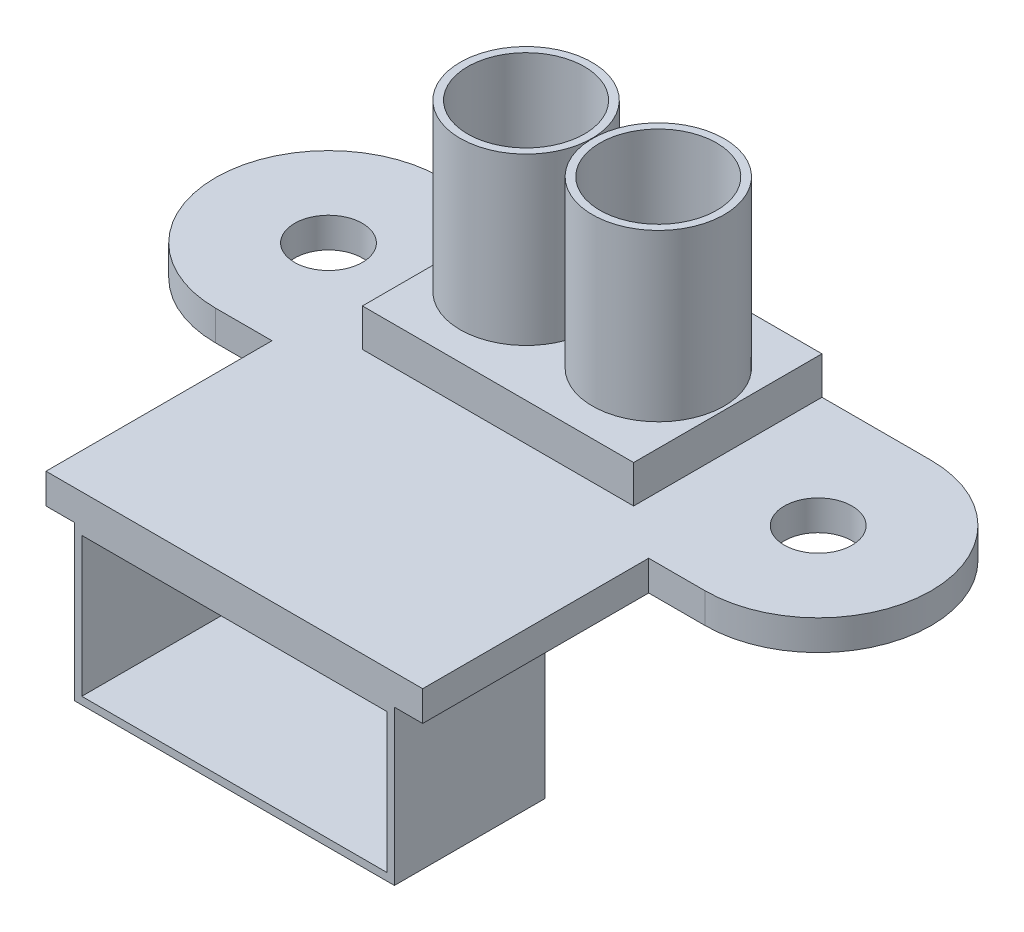
ISO-10303-21;
HEADER;
FILE_DESCRIPTION(('STEP AP214'),'2;1');
FILE_NAME('part.step','',(''),(''),'','','');
FILE_SCHEMA(('AUTOMOTIVE_DESIGN { 1 0 10303 214 1 1 1 1 }'));
ENDSEC;
DATA;
#1=APPLICATION_CONTEXT('core data for automotive mechanical design processes');
#2=APPLICATION_PROTOCOL_DEFINITION('international standard','automotive_design',2000,#1);
#3=PRODUCT_CONTEXT('',#1,'mechanical');
#4=PRODUCT('Part','Part','',(#3));
#5=PRODUCT_RELATED_PRODUCT_CATEGORY('part','',(#4));
#6=PRODUCT_DEFINITION_FORMATION('','',#4);
#7=PRODUCT_DEFINITION_CONTEXT('part definition',#1,'design');
#8=PRODUCT_DEFINITION('design','',#6,#7);
#9=PRODUCT_DEFINITION_SHAPE('','',#8);
#10=(LENGTH_UNIT() NAMED_UNIT(*) SI_UNIT(.MILLI.,.METRE.));
#11=(NAMED_UNIT(*) PLANE_ANGLE_UNIT() SI_UNIT($,.RADIAN.));
#12=(NAMED_UNIT(*) SI_UNIT($,.STERADIAN.) SOLID_ANGLE_UNIT());
#13=UNCERTAINTY_MEASURE_WITH_UNIT(LENGTH_MEASURE(1.E-05),#10,'distance_accuracy_value','');
#14=(GEOMETRIC_REPRESENTATION_CONTEXT(3) GLOBAL_UNCERTAINTY_ASSIGNED_CONTEXT((#13)) GLOBAL_UNIT_ASSIGNED_CONTEXT((#10,
#11,#12)) REPRESENTATION_CONTEXT('',''));
#15=CARTESIAN_POINT('',(0.,0.,0.));
#16=DIRECTION('',(0.,0.,1.));
#17=DIRECTION('',(1.,0.,0.));
#18=AXIS2_PLACEMENT_3D('',#15,#16,#17);
#19=CARTESIAN_POINT('',(-5.,0.8,9.));
#20=DIRECTION('',(0.,0.,-1.));
#21=DIRECTION('',(-1.,0.,0.));
#22=AXIS2_PLACEMENT_3D('',#19,#20,#21);
#23=PLANE('',#22);
#24=DIRECTION('',(1.,0.,0.));
#25=VECTOR('',#24,1.);
#26=CARTESIAN_POINT('',(-5.,0.,9.));
#27=LINE('',#26,#25);
#28=CARTESIAN_POINT('',(-5.,0.,9.));
#29=VERTEX_POINT('',#28);
#30=CARTESIAN_POINT('',(-4.25,0.,9.));
#31=VERTEX_POINT('',#30);
#32=EDGE_CURVE('E328',#29,#31,#27,.T.);
#33=ORIENTED_EDGE('',*,*,#32,.T.);
#34=DIRECTION('',(0.,1.,0.));
#35=VECTOR('',#34,1.);
#36=CARTESIAN_POINT('',(-4.25,-4.1,9.));
#37=LINE('',#36,#35);
#38=CARTESIAN_POINT('',(-4.25,-4.1,9.));
#39=VERTEX_POINT('',#38);
#40=EDGE_CURVE('E224',#39,#31,#37,.T.);
#41=ORIENTED_EDGE('',*,*,#40,.F.);
#42=DIRECTION('',(-1.,0.,0.));
#43=VECTOR('',#42,1.);
#44=CARTESIAN_POINT('',(-4.25,-4.1,9.));
#45=LINE('',#44,#43);
#46=CARTESIAN_POINT('',(4.25,-4.1,9.));
#47=VERTEX_POINT('',#46);
#48=EDGE_CURVE('E222',#47,#39,#45,.T.);
#49=ORIENTED_EDGE('',*,*,#48,.F.);
#50=DIRECTION('',(0.,1.,0.));
#51=VECTOR('',#50,1.);
#52=CARTESIAN_POINT('',(4.25,-4.1,9.));
#53=LINE('',#52,#51);
#54=CARTESIAN_POINT('',(4.25,0.,9.));
#55=VERTEX_POINT('',#54);
#56=EDGE_CURVE('E232',#47,#55,#53,.T.);
#57=ORIENTED_EDGE('',*,*,#56,.T.);
#58=CARTESIAN_POINT('',(5.,0.,9.));
#59=VERTEX_POINT('',#58);
#60=EDGE_CURVE('E327',#55,#59,#27,.T.);
#61=ORIENTED_EDGE('',*,*,#60,.T.);
#62=DIRECTION('',(0.,-1.,0.));
#63=VECTOR('',#62,1.);
#64=CARTESIAN_POINT('',(5.,0.8,9.));
#65=LINE('',#64,#63);
#66=CARTESIAN_POINT('',(5.,0.8,9.));
#67=VERTEX_POINT('',#66);
#68=EDGE_CURVE('E349',#67,#59,#65,.T.);
#69=ORIENTED_EDGE('',*,*,#68,.F.);
#70=DIRECTION('',(1.,0.,0.));
#71=VECTOR('',#70,1.);
#72=CARTESIAN_POINT('',(-5.,0.8,9.));
#73=LINE('',#72,#71);
#74=CARTESIAN_POINT('',(-5.,0.8,9.));
#75=VERTEX_POINT('',#74);
#76=EDGE_CURVE('E309',#75,#67,#73,.T.);
#77=ORIENTED_EDGE('',*,*,#76,.F.);
#78=DIRECTION('',(0.,-1.,0.));
#79=VECTOR('',#78,1.);
#80=CARTESIAN_POINT('',(-5.,0.8,9.));
#81=LINE('',#80,#79);
#82=EDGE_CURVE('E352',#75,#29,#81,.T.);
#83=ORIENTED_EDGE('',*,*,#82,.T.);
#84=EDGE_LOOP('',(#33,#41,#49,#57,#61,#69,#77,#83));
#85=FACE_BOUND('',#84,.T.);
#86=DIRECTION('',(1.,0.,0.));
#87=VECTOR('',#86,1.);
#88=CARTESIAN_POINT('',(0.,-0.2,9.));
#89=LINE('',#88,#87);
#90=CARTESIAN_POINT('',(-4.05,-0.2,9.));
#91=VERTEX_POINT('',#90);
#92=CARTESIAN_POINT('',(4.05,-0.2,9.));
#93=VERTEX_POINT('',#92);
#94=EDGE_CURVE('E53',#91,#93,#89,.T.);
#95=ORIENTED_EDGE('',*,*,#94,.T.);
#96=DIRECTION('',(0.,-1.,0.));
#97=VECTOR('',#96,1.);
#98=CARTESIAN_POINT('',(4.05,0.,9.));
#99=LINE('',#98,#97);
#100=CARTESIAN_POINT('',(4.05,-3.9,9.));
#101=VERTEX_POINT('',#100);
#102=EDGE_CURVE('E191',#93,#101,#99,.T.);
#103=ORIENTED_EDGE('',*,*,#102,.T.);
#104=DIRECTION('',(1.,0.,0.));
#105=VECTOR('',#104,1.);
#106=CARTESIAN_POINT('',(0.,-3.9,9.));
#107=LINE('',#106,#105);
#108=CARTESIAN_POINT('',(-4.05,-3.9,9.));
#109=VERTEX_POINT('',#108);
#110=EDGE_CURVE('E203',#109,#101,#107,.T.);
#111=ORIENTED_EDGE('',*,*,#110,.F.);
#112=DIRECTION('',(0.,-1.,0.));
#113=VECTOR('',#112,1.);
#114=CARTESIAN_POINT('',(-4.05,0.,9.));
#115=LINE('',#114,#113);
#116=EDGE_CURVE('E201',#91,#109,#115,.T.);
#117=ORIENTED_EDGE('',*,*,#116,.F.);
#118=EDGE_LOOP('',(#95,#103,#111,#117));
#119=FACE_BOUND('',#118,.T.);
#120=ADVANCED_FACE('F38',(#85,#119),#23,.F.);
#121=CARTESIAN_POINT('',(-6.5,0.,0.));
#122=DIRECTION('',(0.,1.,0.));
#123=DIRECTION('',(0.,0.,1.));
#124=AXIS2_PLACEMENT_3D('',#121,#122,#123);
#125=PLANE('',#124);
#126=CARTESIAN_POINT('',(6.5,0.,0.));
#127=DIRECTION('',(0.,1.,0.));
#128=DIRECTION('',(0.,0.,1.));
#129=AXIS2_PLACEMENT_3D('',#126,#127,#128);
#130=CIRCLE('',#129,0.9);
#131=CARTESIAN_POINT('',(6.5,0.,0.9));
#132=VERTEX_POINT('',#131);
#133=EDGE_CURVE('E288',#132,#132,#130,.T.);
#134=ORIENTED_EDGE('',*,*,#133,.T.);
#135=EDGE_LOOP('',(#134));
#136=FACE_BOUND('',#135,.T.);
#137=CARTESIAN_POINT('',(-6.5,0.,0.));
#138=DIRECTION('',(0.,1.,0.));
#139=DIRECTION('',(0.,0.,1.));
#140=AXIS2_PLACEMENT_3D('',#137,#138,#139);
#141=CIRCLE('',#140,0.899999999999999);
#142=CARTESIAN_POINT('',(-6.5,0.,0.899999999999999));
#143=VERTEX_POINT('',#142);
#144=EDGE_CURVE('E292',#143,#143,#141,.T.);
#145=ORIENTED_EDGE('',*,*,#144,.T.);
#146=EDGE_LOOP('',(#145));
#147=FACE_BOUND('',#146,.T.);
#148=DIRECTION('',(0.,0.,-1.));
#149=VECTOR('',#148,1.);
#150=CARTESIAN_POINT('',(-4.25,0.,9.));
#151=LINE('',#150,#149);
#152=CARTESIAN_POINT('',(-4.25,0.,5.));
#153=VERTEX_POINT('',#152);
#154=EDGE_CURVE('E210',#31,#153,#151,.T.);
#155=ORIENTED_EDGE('',*,*,#154,.F.);
#156=ORIENTED_EDGE('',*,*,#32,.F.);
#157=DIRECTION('',(0.,0.,1.));
#158=VECTOR('',#157,1.);
#159=CARTESIAN_POINT('',(-5.,0.,3.));
#160=LINE('',#159,#158);
#161=CARTESIAN_POINT('',(-5.,0.,3.));
#162=VERTEX_POINT('',#161);
#163=EDGE_CURVE('E325',#162,#29,#160,.T.);
#164=ORIENTED_EDGE('',*,*,#163,.F.);
#165=DIRECTION('',(1.,0.,0.));
#166=VECTOR('',#165,1.);
#167=CARTESIAN_POINT('',(-6.5,0.,3.));
#168=LINE('',#167,#166);
#169=CARTESIAN_POINT('',(-6.5,0.,3.));
#170=VERTEX_POINT('',#169);
#171=EDGE_CURVE('E323',#170,#162,#168,.T.);
#172=ORIENTED_EDGE('',*,*,#171,.F.);
#173=CARTESIAN_POINT('',(-6.5,0.,0.));
#174=DIRECTION('',(0.,1.,0.));
#175=DIRECTION('',(0.,0.,1.));
#176=AXIS2_PLACEMENT_3D('',#173,#174,#175);
#177=CIRCLE('',#176,3.);
#178=CARTESIAN_POINT('',(-6.5,0.,-3.));
#179=VERTEX_POINT('',#178);
#180=EDGE_CURVE('E298',#179,#170,#177,.T.);
#181=ORIENTED_EDGE('',*,*,#180,.F.);
#182=DIRECTION('',(-1.,0.,0.));
#183=VECTOR('',#182,1.);
#184=CARTESIAN_POINT('',(-6.5,0.,-3.));
#185=LINE('',#184,#183);
#186=CARTESIAN_POINT('',(6.5,0.,-3.));
#187=VERTEX_POINT('',#186);
#188=EDGE_CURVE('E305',#187,#179,#185,.T.);
#189=ORIENTED_EDGE('',*,*,#188,.F.);
#190=CARTESIAN_POINT('',(6.5,0.,0.));
#191=DIRECTION('',(0.,1.,0.));
#192=DIRECTION('',(0.,0.,1.));
#193=AXIS2_PLACEMENT_3D('',#190,#191,#192);
#194=CIRCLE('',#193,3.);
#195=CARTESIAN_POINT('',(6.5,0.,3.));
#196=VERTEX_POINT('',#195);
#197=EDGE_CURVE('E335',#196,#187,#194,.T.);
#198=ORIENTED_EDGE('',*,*,#197,.F.);
#199=DIRECTION('',(1.,0.,0.));
#200=VECTOR('',#199,1.);
#201=CARTESIAN_POINT('',(5.,0.,3.));
#202=LINE('',#201,#200);
#203=CARTESIAN_POINT('',(5.,0.,3.));
#204=VERTEX_POINT('',#203);
#205=EDGE_CURVE('E333',#204,#196,#202,.T.);
#206=ORIENTED_EDGE('',*,*,#205,.F.);
#207=DIRECTION('',(0.,0.,-1.));
#208=VECTOR('',#207,1.);
#209=CARTESIAN_POINT('',(5.,0.,9.));
#210=LINE('',#209,#208);
#211=EDGE_CURVE('E331',#59,#204,#210,.T.);
#212=ORIENTED_EDGE('',*,*,#211,.F.);
#213=ORIENTED_EDGE('',*,*,#60,.F.);
#214=DIRECTION('',(0.,0.,1.));
#215=VECTOR('',#214,1.);
#216=CARTESIAN_POINT('',(4.25,0.,9.));
#217=LINE('',#216,#215);
#218=CARTESIAN_POINT('',(4.25,0.,5.));
#219=VERTEX_POINT('',#218);
#220=EDGE_CURVE('E218',#219,#55,#217,.T.);
#221=ORIENTED_EDGE('',*,*,#220,.F.);
#222=DIRECTION('',(1.,0.,0.));
#223=VECTOR('',#222,1.);
#224=CARTESIAN_POINT('',(-4.25,0.,5.));
#225=LINE('',#224,#223);
#226=EDGE_CURVE('E61',#153,#219,#225,.T.);
#227=ORIENTED_EDGE('',*,*,#226,.F.);
#228=EDGE_LOOP('',(#155,#156,#164,#172,#181,#189,#198,#206,#212,#213,#221,#227));
#229=FACE_BOUND('',#228,.T.);
#230=ADVANCED_FACE('F392',(#136,#147,#229),#125,.F.);
#231=CARTESIAN_POINT('',(-6.5,0.8,0.));
#232=DIRECTION('',(0.,1.,0.));
#233=DIRECTION('',(0.,0.,1.));
#234=AXIS2_PLACEMENT_3D('',#231,#232,#233);
#235=PLANE('',#234);
#236=DIRECTION('',(0.,0.,1.));
#237=VECTOR('',#236,1.);
#238=CARTESIAN_POINT('',(-3.6,0.8,-3.));
#239=LINE('',#238,#237);
#240=CARTESIAN_POINT('',(-3.6,0.8,-3.));
#241=VERTEX_POINT('',#240);
#242=CARTESIAN_POINT('',(-3.6,0.8,2.));
#243=VERTEX_POINT('',#242);
#244=EDGE_CURVE('E256',#241,#243,#239,.T.);
#245=ORIENTED_EDGE('',*,*,#244,.F.);
#246=DIRECTION('',(-1.,0.,0.));
#247=VECTOR('',#246,1.);
#248=CARTESIAN_POINT('',(-6.5,0.8,-3.));
#249=LINE('',#248,#247);
#250=CARTESIAN_POINT('',(-6.5,0.8,-3.));
#251=VERTEX_POINT('',#250);
#252=EDGE_CURVE('E317',#241,#251,#249,.T.);
#253=ORIENTED_EDGE('',*,*,#252,.T.);
#254=CARTESIAN_POINT('',(-6.5,0.8,0.));
#255=DIRECTION('',(0.,1.,0.));
#256=DIRECTION('',(0.,0.,1.));
#257=AXIS2_PLACEMENT_3D('',#254,#255,#256);
#258=CIRCLE('',#257,3.);
#259=CARTESIAN_POINT('',(-6.5,0.8,3.));
#260=VERTEX_POINT('',#259);
#261=EDGE_CURVE('E301',#251,#260,#258,.T.);
#262=ORIENTED_EDGE('',*,*,#261,.T.);
#263=DIRECTION('',(1.,0.,0.));
#264=VECTOR('',#263,1.);
#265=CARTESIAN_POINT('',(-6.5,0.8,3.));
#266=LINE('',#265,#264);
#267=CARTESIAN_POINT('',(-5.,0.8,3.));
#268=VERTEX_POINT('',#267);
#269=EDGE_CURVE('E304',#260,#268,#266,.T.);
#270=ORIENTED_EDGE('',*,*,#269,.T.);
#271=DIRECTION('',(0.,0.,1.));
#272=VECTOR('',#271,1.);
#273=CARTESIAN_POINT('',(-5.,0.8,3.));
#274=LINE('',#273,#272);
#275=EDGE_CURVE('E307',#268,#75,#274,.T.);
#276=ORIENTED_EDGE('',*,*,#275,.T.);
#277=ORIENTED_EDGE('',*,*,#76,.T.);
#278=DIRECTION('',(0.,0.,-1.));
#279=VECTOR('',#278,1.);
#280=CARTESIAN_POINT('',(5.,0.8,9.));
#281=LINE('',#280,#279);
#282=CARTESIAN_POINT('',(5.,0.8,3.));
#283=VERTEX_POINT('',#282);
#284=EDGE_CURVE('E311',#67,#283,#281,.T.);
#285=ORIENTED_EDGE('',*,*,#284,.T.);
#286=DIRECTION('',(1.,0.,0.));
#287=VECTOR('',#286,1.);
#288=CARTESIAN_POINT('',(5.,0.8,3.));
#289=LINE('',#288,#287);
#290=CARTESIAN_POINT('',(6.5,0.8,3.));
#291=VERTEX_POINT('',#290);
#292=EDGE_CURVE('E313',#283,#291,#289,.T.);
#293=ORIENTED_EDGE('',*,*,#292,.T.);
#294=CARTESIAN_POINT('',(6.5,0.8,0.));
#295=DIRECTION('',(0.,1.,0.));
#296=DIRECTION('',(0.,0.,1.));
#297=AXIS2_PLACEMENT_3D('',#294,#295,#296);
#298=CIRCLE('',#297,3.);
#299=CARTESIAN_POINT('',(6.5,0.8,-3.));
#300=VERTEX_POINT('',#299);
#301=EDGE_CURVE('E315',#291,#300,#298,.T.);
#302=ORIENTED_EDGE('',*,*,#301,.T.);
#303=CARTESIAN_POINT('',(3.6,0.8,-3.));
#304=VERTEX_POINT('',#303);
#305=EDGE_CURVE('E318',#300,#304,#249,.T.);
#306=ORIENTED_EDGE('',*,*,#305,.T.);
#307=DIRECTION('',(0.,0.,-1.));
#308=VECTOR('',#307,1.);
#309=CARTESIAN_POINT('',(3.6,0.8,-3.));
#310=LINE('',#309,#308);
#311=CARTESIAN_POINT('',(3.6,0.8,2.));
#312=VERTEX_POINT('',#311);
#313=EDGE_CURVE('E263',#312,#304,#310,.T.);
#314=ORIENTED_EDGE('',*,*,#313,.F.);
#315=DIRECTION('',(1.,0.,0.));
#316=VECTOR('',#315,1.);
#317=CARTESIAN_POINT('',(-3.6,0.8,2.));
#318=LINE('',#317,#316);
#319=EDGE_CURVE('E272',#243,#312,#318,.T.);
#320=ORIENTED_EDGE('',*,*,#319,.F.);
#321=EDGE_LOOP('',(#245,#253,#262,#270,#276,#277,#285,#293,#302,#306,#314,#320));
#322=FACE_BOUND('',#321,.T.);
#323=CARTESIAN_POINT('',(-6.5,0.8,0.));
#324=DIRECTION('',(0.,1.,0.));
#325=DIRECTION('',(0.,0.,1.));
#326=AXIS2_PLACEMENT_3D('',#323,#324,#325);
#327=CIRCLE('',#326,0.899999999999999);
#328=CARTESIAN_POINT('',(-6.5,0.8,0.899999999999999));
#329=VERTEX_POINT('',#328);
#330=EDGE_CURVE('E295',#329,#329,#327,.T.);
#331=ORIENTED_EDGE('',*,*,#330,.F.);
#332=EDGE_LOOP('',(#331));
#333=FACE_BOUND('',#332,.T.);
#334=CARTESIAN_POINT('',(6.5,0.8,0.));
#335=DIRECTION('',(0.,1.,0.));
#336=DIRECTION('',(0.,0.,1.));
#337=AXIS2_PLACEMENT_3D('',#334,#335,#336);
#338=CIRCLE('',#337,0.9);
#339=CARTESIAN_POINT('',(6.5,0.8,0.9));
#340=VERTEX_POINT('',#339);
#341=EDGE_CURVE('E289',#340,#340,#338,.T.);
#342=ORIENTED_EDGE('',*,*,#341,.F.);
#343=EDGE_LOOP('',(#342));
#344=FACE_BOUND('',#343,.T.);
#345=ADVANCED_FACE('F398',(#322,#333,#344),#235,.T.);
#346=CARTESIAN_POINT('',(-6.5,0.8,0.));
#347=DIRECTION('',(0.,-1.,0.));
#348=DIRECTION('',(0.,0.,-1.));
#349=AXIS2_PLACEMENT_3D('',#346,#347,#348);
#350=CYLINDRICAL_SURFACE('',#349,3.);
#351=ORIENTED_EDGE('',*,*,#180,.T.);
#352=DIRECTION('',(0.,-1.,0.));
#353=VECTOR('',#352,1.);
#354=CARTESIAN_POINT('',(-6.5,0.8,3.));
#355=LINE('',#354,#353);
#356=EDGE_CURVE('E358',#260,#170,#355,.T.);
#357=ORIENTED_EDGE('',*,*,#356,.F.);
#358=ORIENTED_EDGE('',*,*,#261,.F.);
#359=DIRECTION('',(0.,-1.,0.));
#360=VECTOR('',#359,1.);
#361=CARTESIAN_POINT('',(-6.5,0.8,-3.));
#362=LINE('',#361,#360);
#363=EDGE_CURVE('E320',#251,#179,#362,.T.);
#364=ORIENTED_EDGE('',*,*,#363,.T.);
#365=EDGE_LOOP('',(#351,#357,#358,#364));
#366=FACE_BOUND('',#365,.T.);
#367=ADVANCED_FACE('F40',(#366),#350,.T.);
#368=CARTESIAN_POINT('',(-6.5,0.8,3.));
#369=DIRECTION('',(0.,0.,-1.));
#370=DIRECTION('',(-1.,0.,0.));
#371=AXIS2_PLACEMENT_3D('',#368,#369,#370);
#372=PLANE('',#371);
#373=ORIENTED_EDGE('',*,*,#171,.T.);
#374=DIRECTION('',(0.,-1.,0.));
#375=VECTOR('',#374,1.);
#376=CARTESIAN_POINT('',(-5.,0.8,3.));
#377=LINE('',#376,#375);
#378=EDGE_CURVE('E355',#268,#162,#377,.T.);
#379=ORIENTED_EDGE('',*,*,#378,.F.);
#380=ORIENTED_EDGE('',*,*,#269,.F.);
#381=ORIENTED_EDGE('',*,*,#356,.T.);
#382=EDGE_LOOP('',(#373,#379,#380,#381));
#383=FACE_BOUND('',#382,.T.);
#384=ADVANCED_FACE('F408',(#383),#372,.F.);
#385=CARTESIAN_POINT('',(-5.,0.8,3.));
#386=DIRECTION('',(1.,0.,0.));
#387=DIRECTION('',(0.,0.,-1.));
#388=AXIS2_PLACEMENT_3D('',#385,#386,#387);
#389=PLANE('',#388);
#390=ORIENTED_EDGE('',*,*,#163,.T.);
#391=ORIENTED_EDGE('',*,*,#82,.F.);
#392=ORIENTED_EDGE('',*,*,#275,.F.);
#393=ORIENTED_EDGE('',*,*,#378,.T.);
#394=EDGE_LOOP('',(#390,#391,#392,#393));
#395=FACE_BOUND('',#394,.T.);
#396=ADVANCED_FACE('F406',(#395),#389,.F.);
#397=CARTESIAN_POINT('',(5.,0.8,9.));
#398=DIRECTION('',(-1.,0.,0.));
#399=DIRECTION('',(0.,0.,1.));
#400=AXIS2_PLACEMENT_3D('',#397,#398,#399);
#401=PLANE('',#400);
#402=ORIENTED_EDGE('',*,*,#211,.T.);
#403=DIRECTION('',(0.,-1.,0.));
#404=VECTOR('',#403,1.);
#405=CARTESIAN_POINT('',(5.,0.8,3.));
#406=LINE('',#405,#404);
#407=EDGE_CURVE('E346',#283,#204,#406,.T.);
#408=ORIENTED_EDGE('',*,*,#407,.F.);
#409=ORIENTED_EDGE('',*,*,#284,.F.);
#410=ORIENTED_EDGE('',*,*,#68,.T.);
#411=EDGE_LOOP('',(#402,#408,#409,#410));
#412=FACE_BOUND('',#411,.T.);
#413=ADVANCED_FACE('F404',(#412),#401,.F.);
#414=CARTESIAN_POINT('',(5.,0.8,3.));
#415=DIRECTION('',(0.,0.,-1.));
#416=DIRECTION('',(-1.,0.,0.));
#417=AXIS2_PLACEMENT_3D('',#414,#415,#416);
#418=PLANE('',#417);
#419=ORIENTED_EDGE('',*,*,#205,.T.);
#420=DIRECTION('',(0.,-1.,0.));
#421=VECTOR('',#420,1.);
#422=CARTESIAN_POINT('',(6.5,0.8,3.));
#423=LINE('',#422,#421);
#424=EDGE_CURVE('E343',#291,#196,#423,.T.);
#425=ORIENTED_EDGE('',*,*,#424,.F.);
#426=ORIENTED_EDGE('',*,*,#292,.F.);
#427=ORIENTED_EDGE('',*,*,#407,.T.);
#428=EDGE_LOOP('',(#419,#425,#426,#427));
#429=FACE_BOUND('',#428,.T.);
#430=ADVANCED_FACE('F497',(#429),#418,.F.);
#431=CARTESIAN_POINT('',(6.5,0.8,0.));
#432=DIRECTION('',(0.,-1.,0.));
#433=DIRECTION('',(0.,0.,-1.));
#434=AXIS2_PLACEMENT_3D('',#431,#432,#433);
#435=CYLINDRICAL_SURFACE('',#434,3.);
#436=ORIENTED_EDGE('',*,*,#197,.T.);
#437=DIRECTION('',(0.,-1.,0.));
#438=VECTOR('',#437,1.);
#439=CARTESIAN_POINT('',(6.5,0.8,-3.));
#440=LINE('',#439,#438);
#441=EDGE_CURVE('E340',#300,#187,#440,.T.);
#442=ORIENTED_EDGE('',*,*,#441,.F.);
#443=ORIENTED_EDGE('',*,*,#301,.F.);
#444=ORIENTED_EDGE('',*,*,#424,.T.);
#445=EDGE_LOOP('',(#436,#442,#443,#444));
#446=FACE_BOUND('',#445,.T.);
#447=ADVANCED_FACE('F493',(#446),#435,.T.);
#448=CARTESIAN_POINT('',(-6.5,0.8,-3.));
#449=DIRECTION('',(0.,0.,1.));
#450=DIRECTION('',(1.,0.,0.));
#451=AXIS2_PLACEMENT_3D('',#448,#449,#450);
#452=PLANE('',#451);
#453=ORIENTED_EDGE('',*,*,#188,.T.);
#454=ORIENTED_EDGE('',*,*,#363,.F.);
#455=ORIENTED_EDGE('',*,*,#252,.F.);
#456=DIRECTION('',(0.,-1.,0.));
#457=VECTOR('',#456,1.);
#458=CARTESIAN_POINT('',(-3.6,1.8,-3.));
#459=LINE('',#458,#457);
#460=CARTESIAN_POINT('',(-3.6,1.8,-3.));
#461=VERTEX_POINT('',#460);
#462=EDGE_CURVE('E269',#461,#241,#459,.T.);
#463=ORIENTED_EDGE('',*,*,#462,.F.);
#464=DIRECTION('',(-1.,0.,0.));
#465=VECTOR('',#464,1.);
#466=CARTESIAN_POINT('',(-3.6,1.8,-3.));
#467=LINE('',#466,#465);
#468=CARTESIAN_POINT('',(3.6,1.8,-3.));
#469=VERTEX_POINT('',#468);
#470=EDGE_CURVE('E267',#469,#461,#467,.T.);
#471=ORIENTED_EDGE('',*,*,#470,.F.);
#472=DIRECTION('',(0.,-1.,0.));
#473=VECTOR('',#472,1.);
#474=CARTESIAN_POINT('',(3.6,1.8,-3.));
#475=LINE('',#474,#473);
#476=EDGE_CURVE('E279',#469,#304,#475,.T.);
#477=ORIENTED_EDGE('',*,*,#476,.T.);
#478=ORIENTED_EDGE('',*,*,#305,.F.);
#479=ORIENTED_EDGE('',*,*,#441,.T.);
#480=EDGE_LOOP('',(#453,#454,#455,#463,#471,#477,#478,#479));
#481=FACE_BOUND('',#480,.T.);
#482=ADVANCED_FACE('F481',(#481),#452,.F.);
#483=CARTESIAN_POINT('',(-6.5,0.8,0.));
#484=DIRECTION('',(0.,-1.,0.));
#485=DIRECTION('',(0.,0.,-1.));
#486=AXIS2_PLACEMENT_3D('',#483,#484,#485);
#487=CYLINDRICAL_SURFACE('',#486,0.899999999999999);
#488=ORIENTED_EDGE('',*,*,#330,.T.);
#489=EDGE_LOOP('',(#488));
#490=FACE_BOUND('',#489,.T.);
#491=ORIENTED_EDGE('',*,*,#144,.F.);
#492=EDGE_LOOP('',(#491));
#493=FACE_BOUND('',#492,.T.);
#494=ADVANCED_FACE('F511',(#490,#493),#487,.F.);
#495=CARTESIAN_POINT('',(6.5,0.8,0.));
#496=DIRECTION('',(0.,-1.,0.));
#497=DIRECTION('',(0.,0.,-1.));
#498=AXIS2_PLACEMENT_3D('',#495,#496,#497);
#499=CYLINDRICAL_SURFACE('',#498,0.9);
#500=ORIENTED_EDGE('',*,*,#341,.T.);
#501=EDGE_LOOP('',(#500));
#502=FACE_BOUND('',#501,.T.);
#503=ORIENTED_EDGE('',*,*,#133,.F.);
#504=EDGE_LOOP('',(#503));
#505=FACE_BOUND('',#504,.T.);
#506=ADVANCED_FACE('F517',(#502,#505),#499,.F.);
#507=CARTESIAN_POINT('',(-3.6,1.8,-3.));
#508=DIRECTION('',(1.,0.,0.));
#509=DIRECTION('',(0.,0.,-1.));
#510=AXIS2_PLACEMENT_3D('',#507,#508,#509);
#511=PLANE('',#510);
#512=ORIENTED_EDGE('',*,*,#244,.T.);
#513=DIRECTION('',(0.,-1.,0.));
#514=VECTOR('',#513,1.);
#515=CARTESIAN_POINT('',(-3.6,1.8,2.));
#516=LINE('',#515,#514);
#517=CARTESIAN_POINT('',(-3.6,1.8,2.));
#518=VERTEX_POINT('',#517);
#519=EDGE_CURVE('E285',#518,#243,#516,.T.);
#520=ORIENTED_EDGE('',*,*,#519,.F.);
#521=DIRECTION('',(0.,0.,1.));
#522=VECTOR('',#521,1.);
#523=CARTESIAN_POINT('',(-3.6,1.8,-3.));
#524=LINE('',#523,#522);
#525=EDGE_CURVE('E259',#461,#518,#524,.T.);
#526=ORIENTED_EDGE('',*,*,#525,.F.);
#527=ORIENTED_EDGE('',*,*,#462,.T.);
#528=EDGE_LOOP('',(#512,#520,#526,#527));
#529=FACE_BOUND('',#528,.T.);
#530=ADVANCED_FACE('F473',(#529),#511,.F.);
#531=CARTESIAN_POINT('',(-3.6,1.8,2.));
#532=DIRECTION('',(0.,0.,-1.));
#533=DIRECTION('',(-1.,0.,0.));
#534=AXIS2_PLACEMENT_3D('',#531,#532,#533);
#535=PLANE('',#534);
#536=ORIENTED_EDGE('',*,*,#319,.T.);
#537=DIRECTION('',(0.,-1.,0.));
#538=VECTOR('',#537,1.);
#539=CARTESIAN_POINT('',(3.6,1.8,2.));
#540=LINE('',#539,#538);
#541=CARTESIAN_POINT('',(3.6,1.8,2.));
#542=VERTEX_POINT('',#541);
#543=EDGE_CURVE('E282',#542,#312,#540,.T.);
#544=ORIENTED_EDGE('',*,*,#543,.F.);
#545=DIRECTION('',(1.,0.,0.));
#546=VECTOR('',#545,1.);
#547=CARTESIAN_POINT('',(-3.6,1.8,2.));
#548=LINE('',#547,#546);
#549=EDGE_CURVE('E262',#518,#542,#548,.T.);
#550=ORIENTED_EDGE('',*,*,#549,.F.);
#551=ORIENTED_EDGE('',*,*,#519,.T.);
#552=EDGE_LOOP('',(#536,#544,#550,#551));
#553=FACE_BOUND('',#552,.T.);
#554=ADVANCED_FACE('F475',(#553),#535,.F.);
#555=CARTESIAN_POINT('',(3.6,1.8,-3.));
#556=DIRECTION('',(-1.,0.,0.));
#557=DIRECTION('',(0.,0.,1.));
#558=AXIS2_PLACEMENT_3D('',#555,#556,#557);
#559=PLANE('',#558);
#560=ORIENTED_EDGE('',*,*,#313,.T.);
#561=ORIENTED_EDGE('',*,*,#476,.F.);
#562=DIRECTION('',(0.,0.,-1.));
#563=VECTOR('',#562,1.);
#564=CARTESIAN_POINT('',(3.6,1.8,-3.));
#565=LINE('',#564,#563);
#566=EDGE_CURVE('E265',#542,#469,#565,.T.);
#567=ORIENTED_EDGE('',*,*,#566,.F.);
#568=ORIENTED_EDGE('',*,*,#543,.T.);
#569=EDGE_LOOP('',(#560,#561,#567,#568));
#570=FACE_BOUND('',#569,.T.);
#571=ADVANCED_FACE('F385',(#570),#559,.F.);
#572=CARTESIAN_POINT('',(0.,1.8,0.));
#573=DIRECTION('',(0.,1.,0.));
#574=DIRECTION('',(0.,0.,1.));
#575=AXIS2_PLACEMENT_3D('',#572,#573,#574);
#576=PLANE('',#575);
#577=CARTESIAN_POINT('',(1.755,1.8,-0.499999999999999));
#578=DIRECTION('',(0.,1.,0.));
#579=DIRECTION('',(0.,0.,-1.));
#580=AXIS2_PLACEMENT_3D('',#577,#578,#579);
#581=CIRCLE('',#580,1.75);
#582=CARTESIAN_POINT('',(1.755,1.8,-2.25));
#583=VERTEX_POINT('',#582);
#584=EDGE_CURVE('E241',#583,#583,#581,.T.);
#585=ORIENTED_EDGE('',*,*,#584,.F.);
#586=EDGE_LOOP('',(#585));
#587=FACE_BOUND('',#586,.T.);
#588=CARTESIAN_POINT('',(-1.755,1.8,-0.5));
#589=DIRECTION('',(0.,1.,0.));
#590=DIRECTION('',(0.,0.,1.));
#591=AXIS2_PLACEMENT_3D('',#588,#589,#590);
#592=CIRCLE('',#591,1.75);
#593=CARTESIAN_POINT('',(-1.755,1.8,1.25));
#594=VERTEX_POINT('',#593);
#595=EDGE_CURVE('E252',#594,#594,#592,.T.);
#596=ORIENTED_EDGE('',*,*,#595,.F.);
#597=EDGE_LOOP('',(#596));
#598=FACE_BOUND('',#597,.T.);
#599=ORIENTED_EDGE('',*,*,#525,.T.);
#600=ORIENTED_EDGE('',*,*,#549,.T.);
#601=ORIENTED_EDGE('',*,*,#566,.T.);
#602=ORIENTED_EDGE('',*,*,#470,.T.);
#603=EDGE_LOOP('',(#599,#600,#601,#602));
#604=FACE_BOUND('',#603,.T.);
#605=ADVANCED_FACE('F369',(#587,#598,#604),#576,.T.);
#606=CARTESIAN_POINT('',(-1.755,6.2,-0.5));
#607=DIRECTION('',(0.,1.,0.));
#608=DIRECTION('',(0.,0.,1.));
#609=AXIS2_PLACEMENT_3D('',#606,#607,#608);
#610=PLANE('',#609);
#611=CARTESIAN_POINT('',(-1.755,6.2,-0.5));
#612=DIRECTION('',(0.,1.,0.));
#613=DIRECTION('',(0.,0.,1.));
#614=AXIS2_PLACEMENT_3D('',#611,#612,#613);
#615=CIRCLE('',#614,1.75);
#616=CARTESIAN_POINT('',(-1.755,6.2,1.25));
#617=VERTEX_POINT('',#616);
#618=EDGE_CURVE('E253',#617,#617,#615,.T.);
#619=ORIENTED_EDGE('',*,*,#618,.T.);
#620=EDGE_LOOP('',(#619));
#621=FACE_BOUND('',#620,.T.);
#622=CARTESIAN_POINT('',(-1.755,6.2,-0.5));
#623=DIRECTION('',(0.,1.,0.));
#624=DIRECTION('',(0.,0.,1.));
#625=AXIS2_PLACEMENT_3D('',#622,#623,#624);
#626=CIRCLE('',#625,1.55);
#627=CARTESIAN_POINT('',(-1.755,6.2,1.05));
#628=VERTEX_POINT('',#627);
#629=EDGE_CURVE('E249',#628,#628,#626,.T.);
#630=ORIENTED_EDGE('',*,*,#629,.F.);
#631=EDGE_LOOP('',(#630));
#632=FACE_BOUND('',#631,.T.);
#633=ADVANCED_FACE('F384',(#621,#632),#610,.T.);
#634=CARTESIAN_POINT('',(-1.755,6.2,-0.5));
#635=DIRECTION('',(0.,-1.,0.));
#636=DIRECTION('',(0.,0.,-1.));
#637=AXIS2_PLACEMENT_3D('',#634,#635,#636);
#638=CYLINDRICAL_SURFACE('',#637,1.75);
#639=ORIENTED_EDGE('',*,*,#618,.F.);
#640=EDGE_LOOP('',(#639));
#641=FACE_BOUND('',#640,.T.);
#642=ORIENTED_EDGE('',*,*,#595,.T.);
#643=EDGE_LOOP('',(#642));
#644=FACE_BOUND('',#643,.T.);
#645=ADVANCED_FACE('F378',(#641,#644),#638,.T.);
#646=CARTESIAN_POINT('',(-1.755,6.2,-0.5));
#647=DIRECTION('',(0.,-1.,0.));
#648=DIRECTION('',(0.,0.,-1.));
#649=AXIS2_PLACEMENT_3D('',#646,#647,#648);
#650=CYLINDRICAL_SURFACE('',#649,1.55);
#651=ORIENTED_EDGE('',*,*,#629,.T.);
#652=EDGE_LOOP('',(#651));
#653=FACE_BOUND('',#652,.T.);
#654=CARTESIAN_POINT('',(-1.755,1.8,-0.5));
#655=DIRECTION('',(0.,1.,0.));
#656=DIRECTION('',(0.,0.,1.));
#657=AXIS2_PLACEMENT_3D('',#654,#655,#656);
#658=CIRCLE('',#657,1.55);
#659=CARTESIAN_POINT('',(-1.755,1.8,1.05));
#660=VERTEX_POINT('',#659);
#661=EDGE_CURVE('E46',#660,#660,#658,.F.);
#662=ORIENTED_EDGE('',*,*,#661,.T.);
#663=EDGE_LOOP('',(#662));
#664=FACE_BOUND('',#663,.T.);
#665=ADVANCED_FACE('F363',(#653,#664),#650,.F.);
#666=ORIENTED_EDGE('',*,*,#661,.F.);
#667=EDGE_LOOP('',(#666));
#668=FACE_BOUND('',#667,.T.);
#669=ADVANCED_FACE('F365',(#668),#576,.T.);
#670=CARTESIAN_POINT('',(1.755,6.2,-0.499999999999999));
#671=DIRECTION('',(0.,-1.,0.));
#672=DIRECTION('',(0.,0.,-1.));
#673=AXIS2_PLACEMENT_3D('',#670,#671,#672);
#674=PLANE('',#673);
#675=CARTESIAN_POINT('',(1.755,6.2,-0.499999999999999));
#676=DIRECTION('',(0.,1.,0.));
#677=DIRECTION('',(0.,0.,-1.));
#678=AXIS2_PLACEMENT_3D('',#675,#676,#677);
#679=CIRCLE('',#678,1.75);
#680=CARTESIAN_POINT('',(1.755,6.2,-2.25));
#681=VERTEX_POINT('',#680);
#682=EDGE_CURVE('E240',#681,#681,#679,.T.);
#683=ORIENTED_EDGE('',*,*,#682,.T.);
#684=EDGE_LOOP('',(#683));
#685=FACE_BOUND('',#684,.T.);
#686=CARTESIAN_POINT('',(1.755,6.2,-0.499999999999999));
#687=DIRECTION('',(0.,1.,0.));
#688=DIRECTION('',(0.,0.,-1.));
#689=AXIS2_PLACEMENT_3D('',#686,#687,#688);
#690=CIRCLE('',#689,1.55);
#691=CARTESIAN_POINT('',(1.755,6.2,-2.05));
#692=VERTEX_POINT('',#691);
#693=EDGE_CURVE('E244',#692,#692,#690,.T.);
#694=ORIENTED_EDGE('',*,*,#693,.F.);
#695=EDGE_LOOP('',(#694));
#696=FACE_BOUND('',#695,.T.);
#697=ADVANCED_FACE('F367',(#685,#696),#674,.F.);
#698=CARTESIAN_POINT('',(1.755,6.2,-0.499999999999999));
#699=DIRECTION('',(0.,-1.,0.));
#700=DIRECTION('',(0.,0.,-1.));
#701=AXIS2_PLACEMENT_3D('',#698,#699,#700);
#702=CYLINDRICAL_SURFACE('',#701,1.75);
#703=ORIENTED_EDGE('',*,*,#682,.F.);
#704=EDGE_LOOP('',(#703));
#705=FACE_BOUND('',#704,.T.);
#706=ORIENTED_EDGE('',*,*,#584,.T.);
#707=EDGE_LOOP('',(#706));
#708=FACE_BOUND('',#707,.T.);
#709=ADVANCED_FACE('F375',(#705,#708),#702,.T.);
#710=CARTESIAN_POINT('',(1.755,6.2,-0.499999999999999));
#711=DIRECTION('',(0.,-1.,0.));
#712=DIRECTION('',(0.,0.,-1.));
#713=AXIS2_PLACEMENT_3D('',#710,#711,#712);
#714=CYLINDRICAL_SURFACE('',#713,1.55);
#715=ORIENTED_EDGE('',*,*,#693,.T.);
#716=EDGE_LOOP('',(#715));
#717=FACE_BOUND('',#716,.T.);
#718=CARTESIAN_POINT('',(1.755,1.8,-0.499999999999999));
#719=DIRECTION('',(0.,1.,0.));
#720=DIRECTION('',(0.,0.,1.));
#721=AXIS2_PLACEMENT_3D('',#718,#719,#720);
#722=CIRCLE('',#721,1.55);
#723=CARTESIAN_POINT('',(1.755,1.8,1.05));
#724=VERTEX_POINT('',#723);
#725=EDGE_CURVE('E11',#724,#724,#722,.F.);
#726=ORIENTED_EDGE('',*,*,#725,.T.);
#727=EDGE_LOOP('',(#726));
#728=FACE_BOUND('',#727,.T.);
#729=ADVANCED_FACE('F389',(#717,#728),#714,.F.);
#730=ORIENTED_EDGE('',*,*,#725,.F.);
#731=EDGE_LOOP('',(#730));
#732=FACE_BOUND('',#731,.T.);
#733=ADVANCED_FACE('F370',(#732),#576,.T.);
#734=CARTESIAN_POINT('',(-4.25,-4.1,9.));
#735=DIRECTION('',(1.,0.,0.));
#736=DIRECTION('',(0.,0.,-1.));
#737=AXIS2_PLACEMENT_3D('',#734,#735,#736);
#738=PLANE('',#737);
#739=ORIENTED_EDGE('',*,*,#154,.T.);
#740=DIRECTION('',(0.,1.,0.));
#741=VECTOR('',#740,1.);
#742=CARTESIAN_POINT('',(-4.25,-4.1,5.));
#743=LINE('',#742,#741);
#744=CARTESIAN_POINT('',(-4.25,-4.1,5.));
#745=VERTEX_POINT('',#744);
#746=EDGE_CURVE('E238',#745,#153,#743,.T.);
#747=ORIENTED_EDGE('',*,*,#746,.F.);
#748=DIRECTION('',(0.,0.,-1.));
#749=VECTOR('',#748,1.);
#750=CARTESIAN_POINT('',(-4.25,-4.1,9.));
#751=LINE('',#750,#749);
#752=EDGE_CURVE('E214',#39,#745,#751,.T.);
#753=ORIENTED_EDGE('',*,*,#752,.F.);
#754=ORIENTED_EDGE('',*,*,#40,.T.);
#755=EDGE_LOOP('',(#739,#747,#753,#754));
#756=FACE_BOUND('',#755,.T.);
#757=ADVANCED_FACE('F388',(#756),#738,.F.);
#758=CARTESIAN_POINT('',(-4.25,-4.1,5.));
#759=DIRECTION('',(0.,0.,1.));
#760=DIRECTION('',(1.,0.,0.));
#761=AXIS2_PLACEMENT_3D('',#758,#759,#760);
#762=PLANE('',#761);
#763=ORIENTED_EDGE('',*,*,#226,.T.);
#764=DIRECTION('',(0.,1.,0.));
#765=VECTOR('',#764,1.);
#766=CARTESIAN_POINT('',(4.25,-4.1,5.));
#767=LINE('',#766,#765);
#768=CARTESIAN_POINT('',(4.25,-4.1,5.));
#769=VERTEX_POINT('',#768);
#770=EDGE_CURVE('E235',#769,#219,#767,.T.);
#771=ORIENTED_EDGE('',*,*,#770,.F.);
#772=DIRECTION('',(1.,0.,0.));
#773=VECTOR('',#772,1.);
#774=CARTESIAN_POINT('',(-4.25,-4.1,5.));
#775=LINE('',#774,#773);
#776=EDGE_CURVE('E217',#745,#769,#775,.T.);
#777=ORIENTED_EDGE('',*,*,#776,.F.);
#778=ORIENTED_EDGE('',*,*,#746,.T.);
#779=EDGE_LOOP('',(#763,#771,#777,#778));
#780=FACE_BOUND('',#779,.T.);
#781=ADVANCED_FACE('F439',(#780),#762,.F.);
#782=CARTESIAN_POINT('',(4.25,-4.1,9.));
#783=DIRECTION('',(-1.,0.,0.));
#784=DIRECTION('',(0.,0.,1.));
#785=AXIS2_PLACEMENT_3D('',#782,#783,#784);
#786=PLANE('',#785);
#787=ORIENTED_EDGE('',*,*,#220,.T.);
#788=ORIENTED_EDGE('',*,*,#56,.F.);
#789=DIRECTION('',(0.,0.,1.));
#790=VECTOR('',#789,1.);
#791=CARTESIAN_POINT('',(4.25,-4.1,9.));
#792=LINE('',#791,#790);
#793=EDGE_CURVE('E220',#769,#47,#792,.T.);
#794=ORIENTED_EDGE('',*,*,#793,.F.);
#795=ORIENTED_EDGE('',*,*,#770,.T.);
#796=EDGE_LOOP('',(#787,#788,#794,#795));
#797=FACE_BOUND('',#796,.T.);
#798=ADVANCED_FACE('F436',(#797),#786,.F.);
#799=CARTESIAN_POINT('',(0.,-4.1,0.));
#800=DIRECTION('',(0.,-1.,0.));
#801=DIRECTION('',(0.,0.,-1.));
#802=AXIS2_PLACEMENT_3D('',#799,#800,#801);
#803=PLANE('',#802);
#804=ORIENTED_EDGE('',*,*,#752,.T.);
#805=ORIENTED_EDGE('',*,*,#776,.T.);
#806=ORIENTED_EDGE('',*,*,#793,.T.);
#807=ORIENTED_EDGE('',*,*,#48,.T.);
#808=EDGE_LOOP('',(#804,#805,#806,#807));
#809=FACE_BOUND('',#808,.T.);
#810=ADVANCED_FACE('F430',(#809),#803,.T.);
#811=CARTESIAN_POINT('',(0.,-0.2,5.2));
#812=DIRECTION('',(0.,-1.,0.));
#813=DIRECTION('',(0.,0.,-1.));
#814=AXIS2_PLACEMENT_3D('',#811,#812,#813);
#815=PLANE('',#814);
#816=ORIENTED_EDGE('',*,*,#94,.F.);
#817=DIRECTION('',(0.,0.,1.));
#818=VECTOR('',#817,1.);
#819=CARTESIAN_POINT('',(-4.05,-0.2,5.2));
#820=LINE('',#819,#818);
#821=CARTESIAN_POINT('',(-4.05,-0.2,5.2));
#822=VERTEX_POINT('',#821);
#823=EDGE_CURVE('E174',#822,#91,#820,.T.);
#824=ORIENTED_EDGE('',*,*,#823,.F.);
#825=DIRECTION('',(1.,0.,0.));
#826=VECTOR('',#825,1.);
#827=CARTESIAN_POINT('',(0.,-0.2,5.2));
#828=LINE('',#827,#826);
#829=CARTESIAN_POINT('',(4.05,-0.2,5.2));
#830=VERTEX_POINT('',#829);
#831=EDGE_CURVE('E177',#822,#830,#828,.T.);
#832=ORIENTED_EDGE('',*,*,#831,.T.);
#833=DIRECTION('',(0.,0.,1.));
#834=VECTOR('',#833,1.);
#835=CARTESIAN_POINT('',(4.05,-0.2,5.2));
#836=LINE('',#835,#834);
#837=EDGE_CURVE('E208',#830,#93,#836,.T.);
#838=ORIENTED_EDGE('',*,*,#837,.T.);
#839=EDGE_LOOP('',(#816,#824,#832,#838));
#840=FACE_BOUND('',#839,.T.);
#841=ADVANCED_FACE('F176',(#840),#815,.T.);
#842=CARTESIAN_POINT('',(4.05,0.,5.2));
#843=DIRECTION('',(-1.,0.,0.));
#844=DIRECTION('',(0.,0.,1.));
#845=AXIS2_PLACEMENT_3D('',#842,#843,#844);
#846=PLANE('',#845);
#847=ORIENTED_EDGE('',*,*,#102,.F.);
#848=ORIENTED_EDGE('',*,*,#837,.F.);
#849=DIRECTION('',(0.,-1.,0.));
#850=VECTOR('',#849,1.);
#851=CARTESIAN_POINT('',(4.05,0.,5.2));
#852=LINE('',#851,#850);
#853=CARTESIAN_POINT('',(4.05,-3.9,5.2));
#854=VERTEX_POINT('',#853);
#855=EDGE_CURVE('E184',#830,#854,#852,.T.);
#856=ORIENTED_EDGE('',*,*,#855,.T.);
#857=DIRECTION('',(0.,0.,1.));
#858=VECTOR('',#857,1.);
#859=CARTESIAN_POINT('',(4.05,-3.9,5.2));
#860=LINE('',#859,#858);
#861=EDGE_CURVE('E211',#854,#101,#860,.T.);
#862=ORIENTED_EDGE('',*,*,#861,.T.);
#863=EDGE_LOOP('',(#847,#848,#856,#862));
#864=FACE_BOUND('',#863,.T.);
#865=ADVANCED_FACE('F631',(#864),#846,.T.);
#866=CARTESIAN_POINT('',(0.,-3.9,5.2));
#867=DIRECTION('',(0.,-1.,0.));
#868=DIRECTION('',(0.,0.,-1.));
#869=AXIS2_PLACEMENT_3D('',#866,#867,#868);
#870=PLANE('',#869);
#871=ORIENTED_EDGE('',*,*,#110,.T.);
#872=ORIENTED_EDGE('',*,*,#861,.F.);
#873=DIRECTION('',(1.,0.,0.));
#874=VECTOR('',#873,1.);
#875=CARTESIAN_POINT('',(0.,-3.9,5.2));
#876=LINE('',#875,#874);
#877=CARTESIAN_POINT('',(-4.05,-3.9,5.2));
#878=VERTEX_POINT('',#877);
#879=EDGE_CURVE('E195',#878,#854,#876,.T.);
#880=ORIENTED_EDGE('',*,*,#879,.F.);
#881=DIRECTION('',(0.,0.,1.));
#882=VECTOR('',#881,1.);
#883=CARTESIAN_POINT('',(-4.05,-3.9,5.2));
#884=LINE('',#883,#882);
#885=EDGE_CURVE('E183',#878,#109,#884,.T.);
#886=ORIENTED_EDGE('',*,*,#885,.T.);
#887=EDGE_LOOP('',(#871,#872,#880,#886));
#888=FACE_BOUND('',#887,.T.);
#889=ADVANCED_FACE('F640',(#888),#870,.F.);
#890=CARTESIAN_POINT('',(-4.05,0.,5.2));
#891=DIRECTION('',(-1.,0.,0.));
#892=DIRECTION('',(0.,0.,1.));
#893=AXIS2_PLACEMENT_3D('',#890,#891,#892);
#894=PLANE('',#893);
#895=ORIENTED_EDGE('',*,*,#116,.T.);
#896=ORIENTED_EDGE('',*,*,#885,.F.);
#897=DIRECTION('',(0.,-1.,0.));
#898=VECTOR('',#897,1.);
#899=CARTESIAN_POINT('',(-4.05,0.,5.2));
#900=LINE('',#899,#898);
#901=EDGE_CURVE('E190',#822,#878,#900,.T.);
#902=ORIENTED_EDGE('',*,*,#901,.F.);
#903=ORIENTED_EDGE('',*,*,#823,.T.);
#904=EDGE_LOOP('',(#895,#896,#902,#903));
#905=FACE_BOUND('',#904,.T.);
#906=ADVANCED_FACE('F193',(#905),#894,.F.);
#907=CARTESIAN_POINT('',(0.,0.,5.2));
#908=DIRECTION('',(0.,0.,1.));
#909=DIRECTION('',(1.,0.,0.));
#910=AXIS2_PLACEMENT_3D('',#907,#908,#909);
#911=PLANE('',#910);
#912=ORIENTED_EDGE('',*,*,#831,.F.);
#913=ORIENTED_EDGE('',*,*,#901,.T.);
#914=ORIENTED_EDGE('',*,*,#879,.T.);
#915=ORIENTED_EDGE('',*,*,#855,.F.);
#916=EDGE_LOOP('',(#912,#913,#914,#915));
#917=FACE_BOUND('',#916,.T.);
#918=ADVANCED_FACE('F188',(#917),#911,.T.);
#919=CLOSED_SHELL('',(#120,#230,#345,#367,#384,#396,#413,#430,#447,#482,#494,#506,#530,#554,
#571,#605,#633,#645,#665,#669,#697,#709,#729,#733,#757,#781,#798,#810,#841,#865,#889,#906,#918));
#920=MANIFOLD_SOLID_BREP('B2',#919);
#921=ADVANCED_BREP_SHAPE_REPRESENTATION('',(#18,#920),#14);
#922=SHAPE_DEFINITION_REPRESENTATION(#9,#921);
ENDSEC;
END-ISO-10303-21;
